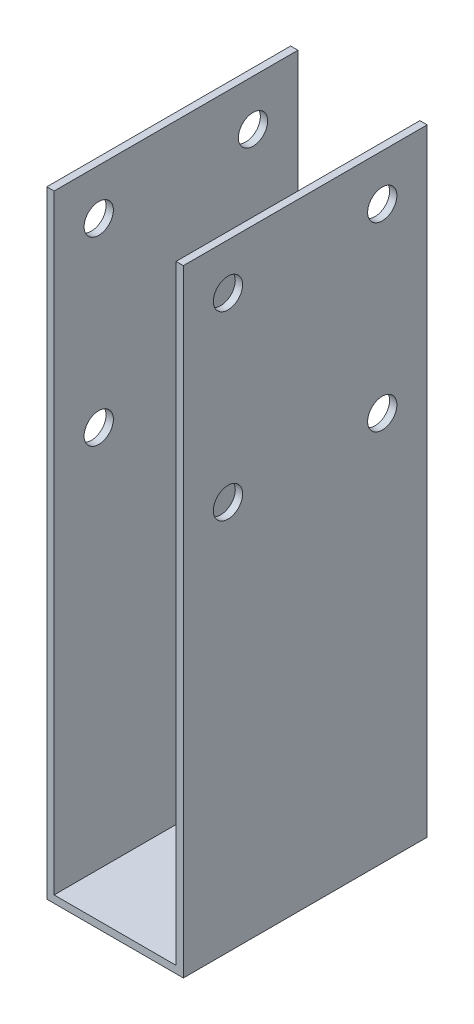
ISO-10303-21;
HEADER;
FILE_DESCRIPTION(('STEP AP214'),'2;1');
FILE_NAME('part.step','',(''),(''),'','','');
FILE_SCHEMA(('AUTOMOTIVE_DESIGN { 1 0 10303 214 1 1 1 1 }'));
ENDSEC;
DATA;
#1=APPLICATION_CONTEXT('core data for automotive mechanical design processes');
#2=APPLICATION_PROTOCOL_DEFINITION('international standard','automotive_design',2000,#1);
#3=PRODUCT_CONTEXT('',#1,'mechanical');
#4=PRODUCT('Part','Part','',(#3));
#5=PRODUCT_RELATED_PRODUCT_CATEGORY('part','',(#4));
#6=PRODUCT_DEFINITION_FORMATION('','',#4);
#7=PRODUCT_DEFINITION_CONTEXT('part definition',#1,'design');
#8=PRODUCT_DEFINITION('design','',#6,#7);
#9=PRODUCT_DEFINITION_SHAPE('','',#8);
#10=(LENGTH_UNIT() NAMED_UNIT(*) SI_UNIT(.MILLI.,.METRE.));
#11=(NAMED_UNIT(*) PLANE_ANGLE_UNIT() SI_UNIT($,.RADIAN.));
#12=(NAMED_UNIT(*) SI_UNIT($,.STERADIAN.) SOLID_ANGLE_UNIT());
#13=UNCERTAINTY_MEASURE_WITH_UNIT(LENGTH_MEASURE(1.E-05),#10,'distance_accuracy_value','');
#14=(GEOMETRIC_REPRESENTATION_CONTEXT(3) GLOBAL_UNCERTAINTY_ASSIGNED_CONTEXT((#13)) GLOBAL_UNIT_ASSIGNED_CONTEXT((#10,
#11,#12)) REPRESENTATION_CONTEXT('',''));
#15=CARTESIAN_POINT('',(0.,0.,0.));
#16=DIRECTION('',(0.,0.,1.));
#17=DIRECTION('',(1.,0.,0.));
#18=AXIS2_PLACEMENT_3D('',#15,#16,#17);
#19=CARTESIAN_POINT('',(25.,125.,100.));
#20=DIRECTION('',(1.,0.,0.));
#21=DIRECTION('',(0.,1.,0.));
#22=AXIS2_PLACEMENT_3D('',#19,#20,#21);
#23=PLANE('',#22);
#24=CARTESIAN_POINT('',(25.,106.115669713315,18.434102117834));
#25=DIRECTION('',(1.,0.,0.));
#26=DIRECTION('',(0.,1.,0.));
#27=AXIS2_PLACEMENT_3D('',#24,#25,#26);
#28=CIRCLE('',#27,6.00000000000001);
#29=CARTESIAN_POINT('',(25.,112.115669713315,18.434102117834));
#30=VERTEX_POINT('',#29);
#31=EDGE_CURVE('E186',#30,#30,#28,.T.);
#32=ORIENTED_EDGE('',*,*,#31,.T.);
#33=EDGE_LOOP('',(#32));
#34=FACE_BOUND('',#33,.T.);
#35=CARTESIAN_POINT('',(25.,31.8283759606693,18.434102117834));
#36=DIRECTION('',(1.,0.,0.));
#37=DIRECTION('',(0.,1.,0.));
#38=AXIS2_PLACEMENT_3D('',#35,#36,#37);
#39=CIRCLE('',#38,6.);
#40=CARTESIAN_POINT('',(25.,37.8283759606693,18.434102117834));
#41=VERTEX_POINT('',#40);
#42=EDGE_CURVE('E194',#41,#41,#39,.T.);
#43=ORIENTED_EDGE('',*,*,#42,.T.);
#44=EDGE_LOOP('',(#43));
#45=FACE_BOUND('',#44,.T.);
#46=CARTESIAN_POINT('',(25.,31.8283759606693,81.7042124749598));
#47=DIRECTION('',(1.,0.,0.));
#48=DIRECTION('',(0.,1.,0.));
#49=AXIS2_PLACEMENT_3D('',#46,#47,#48);
#50=CIRCLE('',#49,6.);
#51=CARTESIAN_POINT('',(25.,37.8283759606694,81.7042124749598));
#52=VERTEX_POINT('',#51);
#53=EDGE_CURVE('E200',#52,#52,#50,.T.);
#54=ORIENTED_EDGE('',*,*,#53,.T.);
#55=EDGE_LOOP('',(#54));
#56=FACE_BOUND('',#55,.T.);
#57=CARTESIAN_POINT('',(25.,106.115669713315,81.7042124749598));
#58=DIRECTION('',(1.,0.,0.));
#59=DIRECTION('',(0.,1.,0.));
#60=AXIS2_PLACEMENT_3D('',#57,#58,#59);
#61=CIRCLE('',#60,5.99999999999999);
#62=CARTESIAN_POINT('',(25.,112.115669713315,81.7042124749598));
#63=VERTEX_POINT('',#62);
#64=EDGE_CURVE('E133',#63,#63,#61,.T.);
#65=ORIENTED_EDGE('',*,*,#64,.T.);
#66=EDGE_LOOP('',(#65));
#67=FACE_BOUND('',#66,.T.);
#68=DIRECTION('',(0.,-1.,0.));
#69=VECTOR('',#68,1.);
#70=CARTESIAN_POINT('',(25.,125.,0.));
#71=LINE('',#70,#69);
#72=CARTESIAN_POINT('',(25.,125.,0.));
#73=VERTEX_POINT('',#72);
#74=CARTESIAN_POINT('',(25.,-125.,0.));
#75=VERTEX_POINT('',#74);
#76=EDGE_CURVE('E129',#73,#75,#71,.T.);
#77=ORIENTED_EDGE('',*,*,#76,.T.);
#78=DIRECTION('',(0.,0.,-1.));
#79=VECTOR('',#78,1.);
#80=CARTESIAN_POINT('',(25.,-125.,100.));
#81=LINE('',#80,#79);
#82=CARTESIAN_POINT('',(25.,-125.,100.));
#83=VERTEX_POINT('',#82);
#84=EDGE_CURVE('E11',#83,#75,#81,.T.);
#85=ORIENTED_EDGE('',*,*,#84,.F.);
#86=DIRECTION('',(0.,-1.,0.));
#87=VECTOR('',#86,1.);
#88=CARTESIAN_POINT('',(25.,125.,100.));
#89=LINE('',#88,#87);
#90=CARTESIAN_POINT('',(25.,125.,100.));
#91=VERTEX_POINT('',#90);
#92=EDGE_CURVE('E144',#91,#83,#89,.T.);
#93=ORIENTED_EDGE('',*,*,#92,.F.);
#94=DIRECTION('',(0.,0.,-1.));
#95=VECTOR('',#94,1.);
#96=CARTESIAN_POINT('',(25.,125.,100.));
#97=LINE('',#96,#95);
#98=EDGE_CURVE('E125',#91,#73,#97,.T.);
#99=ORIENTED_EDGE('',*,*,#98,.T.);
#100=EDGE_LOOP('',(#77,#85,#93,#99));
#101=FACE_BOUND('',#100,.T.);
#102=ADVANCED_FACE('F33',(#34,#45,#56,#67,#101),#23,.F.);
#103=CARTESIAN_POINT('',(-25.,-125.,100.));
#104=DIRECTION('',(0.,-1.,0.));
#105=DIRECTION('',(1.,0.,0.));
#106=AXIS2_PLACEMENT_3D('',#103,#104,#105);
#107=PLANE('',#106);
#108=DIRECTION('',(-1.,0.,0.));
#109=VECTOR('',#108,1.);
#110=CARTESIAN_POINT('',(-25.,-125.,0.));
#111=LINE('',#110,#109);
#112=CARTESIAN_POINT('',(-25.,-125.,0.));
#113=VERTEX_POINT('',#112);
#114=EDGE_CURVE('E132',#75,#113,#111,.T.);
#115=ORIENTED_EDGE('',*,*,#114,.T.);
#116=DIRECTION('',(0.,0.,-1.));
#117=VECTOR('',#116,1.);
#118=CARTESIAN_POINT('',(-25.,-125.,100.));
#119=LINE('',#118,#117);
#120=CARTESIAN_POINT('',(-25.,-125.,100.));
#121=VERTEX_POINT('',#120);
#122=EDGE_CURVE('E41',#121,#113,#119,.T.);
#123=ORIENTED_EDGE('',*,*,#122,.F.);
#124=DIRECTION('',(-1.,0.,0.));
#125=VECTOR('',#124,1.);
#126=CARTESIAN_POINT('',(-25.,-125.,100.));
#127=LINE('',#126,#125);
#128=EDGE_CURVE('E92',#83,#121,#127,.T.);
#129=ORIENTED_EDGE('',*,*,#128,.F.);
#130=ORIENTED_EDGE('',*,*,#84,.T.);
#131=EDGE_LOOP('',(#115,#123,#129,#130));
#132=FACE_BOUND('',#131,.T.);
#133=ADVANCED_FACE('F237',(#132),#107,.F.);
#134=CARTESIAN_POINT('',(-25.,125.,100.));
#135=DIRECTION('',(-1.,0.,0.));
#136=DIRECTION('',(0.,-1.,0.));
#137=AXIS2_PLACEMENT_3D('',#134,#135,#136);
#138=PLANE('',#137);
#139=CARTESIAN_POINT('',(-25.,106.115669713315,18.434102117834));
#140=DIRECTION('',(-1.,0.,0.));
#141=DIRECTION('',(0.,-1.,0.));
#142=AXIS2_PLACEMENT_3D('',#139,#140,#141);
#143=CIRCLE('',#142,6.00000000000001);
#144=CARTESIAN_POINT('',(-25.,100.115669713315,18.434102117834));
#145=VERTEX_POINT('',#144);
#146=EDGE_CURVE('E191',#145,#145,#143,.T.);
#147=ORIENTED_EDGE('',*,*,#146,.T.);
#148=EDGE_LOOP('',(#147));
#149=FACE_BOUND('',#148,.T.);
#150=CARTESIAN_POINT('',(-25.,31.8283759606693,18.434102117834));
#151=DIRECTION('',(-1.,0.,0.));
#152=DIRECTION('',(0.,-1.,0.));
#153=AXIS2_PLACEMENT_3D('',#150,#151,#152);
#154=CIRCLE('',#153,6.);
#155=CARTESIAN_POINT('',(-25.,25.8283759606693,18.434102117834));
#156=VERTEX_POINT('',#155);
#157=EDGE_CURVE('E197',#156,#156,#154,.T.);
#158=ORIENTED_EDGE('',*,*,#157,.T.);
#159=EDGE_LOOP('',(#158));
#160=FACE_BOUND('',#159,.T.);
#161=CARTESIAN_POINT('',(-25.,31.8283759606693,81.7042124749598));
#162=DIRECTION('',(-1.,0.,0.));
#163=DIRECTION('',(0.,-1.,0.));
#164=AXIS2_PLACEMENT_3D('',#161,#162,#163);
#165=CIRCLE('',#164,6.);
#166=CARTESIAN_POINT('',(-25.,25.8283759606693,81.7042124749598));
#167=VERTEX_POINT('',#166);
#168=EDGE_CURVE('E203',#167,#167,#165,.T.);
#169=ORIENTED_EDGE('',*,*,#168,.T.);
#170=EDGE_LOOP('',(#169));
#171=FACE_BOUND('',#170,.T.);
#172=CARTESIAN_POINT('',(-25.,106.115669713315,81.7042124749598));
#173=DIRECTION('',(-1.,0.,0.));
#174=DIRECTION('',(0.,-1.,0.));
#175=AXIS2_PLACEMENT_3D('',#172,#173,#174);
#176=CIRCLE('',#175,5.99999999999999);
#177=CARTESIAN_POINT('',(-25.,100.115669713315,81.7042124749598));
#178=VERTEX_POINT('',#177);
#179=EDGE_CURVE('E179',#178,#178,#176,.T.);
#180=ORIENTED_EDGE('',*,*,#179,.T.);
#181=EDGE_LOOP('',(#180));
#182=FACE_BOUND('',#181,.T.);
#183=DIRECTION('',(0.,1.,0.));
#184=VECTOR('',#183,1.);
#185=CARTESIAN_POINT('',(-25.,125.,0.));
#186=LINE('',#185,#184);
#187=CARTESIAN_POINT('',(-25.,125.,0.));
#188=VERTEX_POINT('',#187);
#189=EDGE_CURVE('E135',#113,#188,#186,.T.);
#190=ORIENTED_EDGE('',*,*,#189,.T.);
#191=DIRECTION('',(0.,0.,-1.));
#192=VECTOR('',#191,1.);
#193=CARTESIAN_POINT('',(-25.,125.,100.));
#194=LINE('',#193,#192);
#195=CARTESIAN_POINT('',(-25.,125.,100.));
#196=VERTEX_POINT('',#195);
#197=EDGE_CURVE('E151',#196,#188,#194,.T.);
#198=ORIENTED_EDGE('',*,*,#197,.F.);
#199=DIRECTION('',(0.,1.,0.));
#200=VECTOR('',#199,1.);
#201=CARTESIAN_POINT('',(-25.,125.,100.));
#202=LINE('',#201,#200);
#203=EDGE_CURVE('E159',#121,#196,#202,.T.);
#204=ORIENTED_EDGE('',*,*,#203,.F.);
#205=ORIENTED_EDGE('',*,*,#122,.T.);
#206=EDGE_LOOP('',(#190,#198,#204,#205));
#207=FACE_BOUND('',#206,.T.);
#208=ADVANCED_FACE('F157',(#149,#160,#171,#182,#207),#138,.F.);
#209=CARTESIAN_POINT('',(-25.,125.,100.));
#210=DIRECTION('',(0.,-1.,0.));
#211=DIRECTION('',(0.,0.,-1.));
#212=AXIS2_PLACEMENT_3D('',#209,#210,#211);
#213=PLANE('',#212);
#214=DIRECTION('',(-1.,0.,0.));
#215=VECTOR('',#214,1.);
#216=CARTESIAN_POINT('',(-25.,125.,0.));
#217=LINE('',#216,#215);
#218=CARTESIAN_POINT('',(-28.,125.,0.));
#219=VERTEX_POINT('',#218);
#220=EDGE_CURVE('E137',#188,#219,#217,.T.);
#221=ORIENTED_EDGE('',*,*,#220,.T.);
#222=DIRECTION('',(0.,0.,-1.));
#223=VECTOR('',#222,1.);
#224=CARTESIAN_POINT('',(-28.,125.,100.));
#225=LINE('',#224,#223);
#226=CARTESIAN_POINT('',(-28.,125.,100.));
#227=VERTEX_POINT('',#226);
#228=EDGE_CURVE('E148',#227,#219,#225,.T.);
#229=ORIENTED_EDGE('',*,*,#228,.F.);
#230=DIRECTION('',(-1.,0.,0.));
#231=VECTOR('',#230,1.);
#232=CARTESIAN_POINT('',(-25.,125.,100.));
#233=LINE('',#232,#231);
#234=EDGE_CURVE('E171',#196,#227,#233,.T.);
#235=ORIENTED_EDGE('',*,*,#234,.F.);
#236=ORIENTED_EDGE('',*,*,#197,.T.);
#237=EDGE_LOOP('',(#221,#229,#235,#236));
#238=FACE_BOUND('',#237,.T.);
#239=ADVANCED_FACE('F167',(#238),#213,.F.);
#240=CARTESIAN_POINT('',(-28.,125.,100.));
#241=DIRECTION('',(1.,0.,0.));
#242=DIRECTION('',(0.,1.,0.));
#243=AXIS2_PLACEMENT_3D('',#240,#241,#242);
#244=PLANE('',#243);
#245=CARTESIAN_POINT('',(-28.,106.115669713315,18.434102117834));
#246=DIRECTION('',(1.,0.,0.));
#247=DIRECTION('',(0.,1.,0.));
#248=AXIS2_PLACEMENT_3D('',#245,#246,#247);
#249=CIRCLE('',#248,6.00000000000001);
#250=CARTESIAN_POINT('',(-28.,112.115669713315,18.434102117834));
#251=VERTEX_POINT('',#250);
#252=EDGE_CURVE('E206',#251,#251,#249,.T.);
#253=ORIENTED_EDGE('',*,*,#252,.T.);
#254=EDGE_LOOP('',(#253));
#255=FACE_BOUND('',#254,.T.);
#256=CARTESIAN_POINT('',(-28.,31.8283759606693,18.434102117834));
#257=DIRECTION('',(1.,0.,0.));
#258=DIRECTION('',(0.,1.,0.));
#259=AXIS2_PLACEMENT_3D('',#256,#257,#258);
#260=CIRCLE('',#259,6.);
#261=CARTESIAN_POINT('',(-28.,37.8283759606693,18.434102117834));
#262=VERTEX_POINT('',#261);
#263=EDGE_CURVE('E216',#262,#262,#260,.T.);
#264=ORIENTED_EDGE('',*,*,#263,.T.);
#265=EDGE_LOOP('',(#264));
#266=FACE_BOUND('',#265,.T.);
#267=CARTESIAN_POINT('',(-28.,31.8283759606693,81.7042124749598));
#268=DIRECTION('',(1.,0.,0.));
#269=DIRECTION('',(0.,1.,0.));
#270=AXIS2_PLACEMENT_3D('',#267,#268,#269);
#271=CIRCLE('',#270,6.);
#272=CARTESIAN_POINT('',(-28.,37.8283759606693,81.7042124749598));
#273=VERTEX_POINT('',#272);
#274=EDGE_CURVE('E210',#273,#273,#271,.T.);
#275=ORIENTED_EDGE('',*,*,#274,.T.);
#276=EDGE_LOOP('',(#275));
#277=FACE_BOUND('',#276,.T.);
#278=CARTESIAN_POINT('',(-28.,106.115669713315,81.7042124749598));
#279=DIRECTION('',(1.,0.,0.));
#280=DIRECTION('',(0.,1.,0.));
#281=AXIS2_PLACEMENT_3D('',#278,#279,#280);
#282=CIRCLE('',#281,5.99999999999999);
#283=CARTESIAN_POINT('',(-28.,112.115669713315,81.7042124749598));
#284=VERTEX_POINT('',#283);
#285=EDGE_CURVE('E182',#284,#284,#282,.T.);
#286=ORIENTED_EDGE('',*,*,#285,.T.);
#287=EDGE_LOOP('',(#286));
#288=FACE_BOUND('',#287,.T.);
#289=DIRECTION('',(0.,-1.,0.));
#290=VECTOR('',#289,1.);
#291=CARTESIAN_POINT('',(-28.,125.,0.));
#292=LINE('',#291,#290);
#293=CARTESIAN_POINT('',(-28.,-128.,0.));
#294=VERTEX_POINT('',#293);
#295=EDGE_CURVE('E139',#219,#294,#292,.T.);
#296=ORIENTED_EDGE('',*,*,#295,.T.);
#297=DIRECTION('',(0.,0.,-1.));
#298=VECTOR('',#297,1.);
#299=CARTESIAN_POINT('',(-28.,-128.,100.));
#300=LINE('',#299,#298);
#301=CARTESIAN_POINT('',(-28.,-128.,100.));
#302=VERTEX_POINT('',#301);
#303=EDGE_CURVE('E120',#302,#294,#300,.T.);
#304=ORIENTED_EDGE('',*,*,#303,.F.);
#305=DIRECTION('',(0.,-1.,0.));
#306=VECTOR('',#305,1.);
#307=CARTESIAN_POINT('',(-28.,125.,100.));
#308=LINE('',#307,#306);
#309=EDGE_CURVE('E111',#227,#302,#308,.T.);
#310=ORIENTED_EDGE('',*,*,#309,.F.);
#311=ORIENTED_EDGE('',*,*,#228,.T.);
#312=EDGE_LOOP('',(#296,#304,#310,#311));
#313=FACE_BOUND('',#312,.T.);
#314=ADVANCED_FACE('F170',(#255,#266,#277,#288,#313),#244,.F.);
#315=CARTESIAN_POINT('',(-28.,-128.,100.));
#316=DIRECTION('',(0.,1.,0.));
#317=DIRECTION('',(-1.,0.,0.));
#318=AXIS2_PLACEMENT_3D('',#315,#316,#317);
#319=PLANE('',#318);
#320=DIRECTION('',(1.,0.,0.));
#321=VECTOR('',#320,1.);
#322=CARTESIAN_POINT('',(-28.,-128.,0.));
#323=LINE('',#322,#321);
#324=CARTESIAN_POINT('',(28.,-128.,0.));
#325=VERTEX_POINT('',#324);
#326=EDGE_CURVE('E119',#294,#325,#323,.T.);
#327=ORIENTED_EDGE('',*,*,#326,.T.);
#328=DIRECTION('',(0.,0.,-1.));
#329=VECTOR('',#328,1.);
#330=CARTESIAN_POINT('',(28.,-128.,100.));
#331=LINE('',#330,#329);
#332=CARTESIAN_POINT('',(28.,-128.,100.));
#333=VERTEX_POINT('',#332);
#334=EDGE_CURVE('E116',#333,#325,#331,.T.);
#335=ORIENTED_EDGE('',*,*,#334,.F.);
#336=DIRECTION('',(1.,0.,0.));
#337=VECTOR('',#336,1.);
#338=CARTESIAN_POINT('',(-28.,-128.,100.));
#339=LINE('',#338,#337);
#340=EDGE_CURVE('E105',#302,#333,#339,.T.);
#341=ORIENTED_EDGE('',*,*,#340,.F.);
#342=ORIENTED_EDGE('',*,*,#303,.T.);
#343=EDGE_LOOP('',(#327,#335,#341,#342));
#344=FACE_BOUND('',#343,.T.);
#345=ADVANCED_FACE('F117',(#344),#319,.F.);
#346=CARTESIAN_POINT('',(28.,125.,100.));
#347=DIRECTION('',(-1.,0.,0.));
#348=DIRECTION('',(0.,-1.,0.));
#349=AXIS2_PLACEMENT_3D('',#346,#347,#348);
#350=PLANE('',#349);
#351=CARTESIAN_POINT('',(28.,106.115669713315,18.434102117834));
#352=DIRECTION('',(1.,0.,0.));
#353=DIRECTION('',(0.,1.,0.));
#354=AXIS2_PLACEMENT_3D('',#351,#352,#353);
#355=CIRCLE('',#354,6.00000000000001);
#356=CARTESIAN_POINT('',(28.,112.115669713315,18.434102117834));
#357=VERTEX_POINT('',#356);
#358=EDGE_CURVE('E219',#357,#357,#355,.T.);
#359=ORIENTED_EDGE('',*,*,#358,.F.);
#360=EDGE_LOOP('',(#359));
#361=FACE_BOUND('',#360,.T.);
#362=CARTESIAN_POINT('',(28.,31.8283759606693,18.434102117834));
#363=DIRECTION('',(1.,0.,0.));
#364=DIRECTION('',(0.,1.,0.));
#365=AXIS2_PLACEMENT_3D('',#362,#363,#364);
#366=CIRCLE('',#365,6.);
#367=CARTESIAN_POINT('',(28.,37.8283759606693,18.434102117834));
#368=VERTEX_POINT('',#367);
#369=EDGE_CURVE('E213',#368,#368,#366,.T.);
#370=ORIENTED_EDGE('',*,*,#369,.F.);
#371=EDGE_LOOP('',(#370));
#372=FACE_BOUND('',#371,.T.);
#373=CARTESIAN_POINT('',(28.,31.8283759606693,81.7042124749598));
#374=DIRECTION('',(1.,0.,0.));
#375=DIRECTION('',(0.,1.,0.));
#376=AXIS2_PLACEMENT_3D('',#373,#374,#375);
#377=CIRCLE('',#376,6.);
#378=CARTESIAN_POINT('',(28.,37.8283759606694,81.7042124749598));
#379=VERTEX_POINT('',#378);
#380=EDGE_CURVE('E207',#379,#379,#377,.T.);
#381=ORIENTED_EDGE('',*,*,#380,.F.);
#382=EDGE_LOOP('',(#381));
#383=FACE_BOUND('',#382,.T.);
#384=CARTESIAN_POINT('',(28.,106.115669713315,81.7042124749598));
#385=DIRECTION('',(1.,0.,0.));
#386=DIRECTION('',(0.,1.,0.));
#387=AXIS2_PLACEMENT_3D('',#384,#385,#386);
#388=CIRCLE('',#387,5.99999999999999);
#389=CARTESIAN_POINT('',(28.,112.115669713315,81.7042124749598));
#390=VERTEX_POINT('',#389);
#391=EDGE_CURVE('E183',#390,#390,#388,.T.);
#392=ORIENTED_EDGE('',*,*,#391,.F.);
#393=EDGE_LOOP('',(#392));
#394=FACE_BOUND('',#393,.T.);
#395=DIRECTION('',(0.,1.,0.));
#396=VECTOR('',#395,1.);
#397=CARTESIAN_POINT('',(28.,125.,0.));
#398=LINE('',#397,#396);
#399=CARTESIAN_POINT('',(28.,125.,0.));
#400=VERTEX_POINT('',#399);
#401=EDGE_CURVE('E78',#325,#400,#398,.T.);
#402=ORIENTED_EDGE('',*,*,#401,.T.);
#403=DIRECTION('',(0.,0.,-1.));
#404=VECTOR('',#403,1.);
#405=CARTESIAN_POINT('',(28.,125.,100.));
#406=LINE('',#405,#404);
#407=CARTESIAN_POINT('',(28.,125.,100.));
#408=VERTEX_POINT('',#407);
#409=EDGE_CURVE('E121',#408,#400,#406,.T.);
#410=ORIENTED_EDGE('',*,*,#409,.F.);
#411=DIRECTION('',(0.,1.,0.));
#412=VECTOR('',#411,1.);
#413=CARTESIAN_POINT('',(28.,125.,100.));
#414=LINE('',#413,#412);
#415=EDGE_CURVE('E109',#333,#408,#414,.T.);
#416=ORIENTED_EDGE('',*,*,#415,.F.);
#417=ORIENTED_EDGE('',*,*,#334,.T.);
#418=EDGE_LOOP('',(#402,#410,#416,#417));
#419=FACE_BOUND('',#418,.T.);
#420=ADVANCED_FACE('F123',(#361,#372,#383,#394,#419),#350,.F.);
#421=CARTESIAN_POINT('',(25.,125.,100.));
#422=DIRECTION('',(0.,-1.,0.));
#423=DIRECTION('',(0.,0.,-1.));
#424=AXIS2_PLACEMENT_3D('',#421,#422,#423);
#425=PLANE('',#424);
#426=DIRECTION('',(-1.,0.,0.));
#427=VECTOR('',#426,1.);
#428=CARTESIAN_POINT('',(25.,125.,0.));
#429=LINE('',#428,#427);
#430=EDGE_CURVE('E84',#400,#73,#429,.T.);
#431=ORIENTED_EDGE('',*,*,#430,.T.);
#432=ORIENTED_EDGE('',*,*,#98,.F.);
#433=DIRECTION('',(-1.,0.,0.));
#434=VECTOR('',#433,1.);
#435=CARTESIAN_POINT('',(25.,125.,100.));
#436=LINE('',#435,#434);
#437=EDGE_CURVE('E49',#408,#91,#436,.T.);
#438=ORIENTED_EDGE('',*,*,#437,.F.);
#439=ORIENTED_EDGE('',*,*,#409,.T.);
#440=EDGE_LOOP('',(#431,#432,#438,#439));
#441=FACE_BOUND('',#440,.T.);
#442=ADVANCED_FACE('F278',(#441),#425,.F.);
#443=CARTESIAN_POINT('',(0.,0.,100.));
#444=DIRECTION('',(0.,0.,1.));
#445=DIRECTION('',(1.,0.,0.));
#446=AXIS2_PLACEMENT_3D('',#443,#444,#445);
#447=PLANE('',#446);
#448=ORIENTED_EDGE('',*,*,#92,.T.);
#449=ORIENTED_EDGE('',*,*,#128,.T.);
#450=ORIENTED_EDGE('',*,*,#203,.T.);
#451=ORIENTED_EDGE('',*,*,#234,.T.);
#452=ORIENTED_EDGE('',*,*,#309,.T.);
#453=ORIENTED_EDGE('',*,*,#340,.T.);
#454=ORIENTED_EDGE('',*,*,#415,.T.);
#455=ORIENTED_EDGE('',*,*,#437,.T.);
#456=EDGE_LOOP('',(#448,#449,#450,#451,#452,#453,#454,#455));
#457=FACE_BOUND('',#456,.T.);
#458=ADVANCED_FACE('F107',(#457),#447,.T.);
#459=CARTESIAN_POINT('',(0.,0.,0.));
#460=DIRECTION('',(0.,0.,1.));
#461=DIRECTION('',(1.,0.,0.));
#462=AXIS2_PLACEMENT_3D('',#459,#460,#461);
#463=PLANE('',#462);
#464=ORIENTED_EDGE('',*,*,#76,.F.);
#465=ORIENTED_EDGE('',*,*,#430,.F.);
#466=ORIENTED_EDGE('',*,*,#401,.F.);
#467=ORIENTED_EDGE('',*,*,#326,.F.);
#468=ORIENTED_EDGE('',*,*,#295,.F.);
#469=ORIENTED_EDGE('',*,*,#220,.F.);
#470=ORIENTED_EDGE('',*,*,#189,.F.);
#471=ORIENTED_EDGE('',*,*,#114,.F.);
#472=EDGE_LOOP('',(#464,#465,#466,#467,#468,#469,#470,#471));
#473=FACE_BOUND('',#472,.T.);
#474=ADVANCED_FACE('F163',(#473),#463,.F.);
#475=CARTESIAN_POINT('',(-28.,106.115669713315,81.7042124749598));
#476=DIRECTION('',(1.,0.,0.));
#477=DIRECTION('',(0.,1.,0.));
#478=AXIS2_PLACEMENT_3D('',#475,#476,#477);
#479=CYLINDRICAL_SURFACE('',#478,5.99999999999999);
#480=ORIENTED_EDGE('',*,*,#391,.T.);
#481=EDGE_LOOP('',(#480));
#482=FACE_BOUND('',#481,.T.);
#483=ORIENTED_EDGE('',*,*,#64,.F.);
#484=EDGE_LOOP('',(#483));
#485=FACE_BOUND('',#484,.T.);
#486=ADVANCED_FACE('F248',(#482,#485),#479,.F.);
#487=ORIENTED_EDGE('',*,*,#285,.F.);
#488=EDGE_LOOP('',(#487));
#489=FACE_BOUND('',#488,.T.);
#490=ORIENTED_EDGE('',*,*,#179,.F.);
#491=EDGE_LOOP('',(#490));
#492=FACE_BOUND('',#491,.T.);
#493=ADVANCED_FACE('F245',(#489,#492),#479,.F.);
#494=CARTESIAN_POINT('',(-28.,31.8283759606693,81.7042124749598));
#495=DIRECTION('',(1.,0.,0.));
#496=DIRECTION('',(0.,1.,0.));
#497=AXIS2_PLACEMENT_3D('',#494,#495,#496);
#498=CYLINDRICAL_SURFACE('',#497,6.);
#499=ORIENTED_EDGE('',*,*,#380,.T.);
#500=EDGE_LOOP('',(#499));
#501=FACE_BOUND('',#500,.T.);
#502=ORIENTED_EDGE('',*,*,#53,.F.);
#503=EDGE_LOOP('',(#502));
#504=FACE_BOUND('',#503,.T.);
#505=ADVANCED_FACE('F247',(#501,#504),#498,.F.);
#506=CARTESIAN_POINT('',(-28.,31.8283759606693,18.434102117834));
#507=DIRECTION('',(1.,0.,0.));
#508=DIRECTION('',(0.,1.,0.));
#509=AXIS2_PLACEMENT_3D('',#506,#507,#508);
#510=CYLINDRICAL_SURFACE('',#509,6.);
#511=ORIENTED_EDGE('',*,*,#369,.T.);
#512=EDGE_LOOP('',(#511));
#513=FACE_BOUND('',#512,.T.);
#514=ORIENTED_EDGE('',*,*,#42,.F.);
#515=EDGE_LOOP('',(#514));
#516=FACE_BOUND('',#515,.T.);
#517=ADVANCED_FACE('F255',(#513,#516),#510,.F.);
#518=CARTESIAN_POINT('',(-28.,106.115669713315,18.434102117834));
#519=DIRECTION('',(1.,0.,0.));
#520=DIRECTION('',(0.,1.,0.));
#521=AXIS2_PLACEMENT_3D('',#518,#519,#520);
#522=CYLINDRICAL_SURFACE('',#521,6.00000000000001);
#523=ORIENTED_EDGE('',*,*,#358,.T.);
#524=EDGE_LOOP('',(#523));
#525=FACE_BOUND('',#524,.T.);
#526=ORIENTED_EDGE('',*,*,#31,.F.);
#527=EDGE_LOOP('',(#526));
#528=FACE_BOUND('',#527,.T.);
#529=ADVANCED_FACE('F232',(#525,#528),#522,.F.);
#530=ORIENTED_EDGE('',*,*,#274,.F.);
#531=EDGE_LOOP('',(#530));
#532=FACE_BOUND('',#531,.T.);
#533=ORIENTED_EDGE('',*,*,#168,.F.);
#534=EDGE_LOOP('',(#533));
#535=FACE_BOUND('',#534,.T.);
#536=ADVANCED_FACE('F258',(#532,#535),#498,.F.);
#537=ORIENTED_EDGE('',*,*,#263,.F.);
#538=EDGE_LOOP('',(#537));
#539=FACE_BOUND('',#538,.T.);
#540=ORIENTED_EDGE('',*,*,#157,.F.);
#541=EDGE_LOOP('',(#540));
#542=FACE_BOUND('',#541,.T.);
#543=ADVANCED_FACE('F230',(#539,#542),#510,.F.);
#544=ORIENTED_EDGE('',*,*,#252,.F.);
#545=EDGE_LOOP('',(#544));
#546=FACE_BOUND('',#545,.T.);
#547=ORIENTED_EDGE('',*,*,#146,.F.);
#548=EDGE_LOOP('',(#547));
#549=FACE_BOUND('',#548,.T.);
#550=ADVANCED_FACE('F227',(#546,#549),#522,.F.);
#551=CLOSED_SHELL('',(#102,#133,#208,#239,#314,#345,#420,#442,#458,#474,#486,#493,#505,#517,
#529,#536,#543,#550));
#552=MANIFOLD_SOLID_BREP('B2',#551);
#553=ADVANCED_BREP_SHAPE_REPRESENTATION('',(#18,#552),#14);
#554=SHAPE_DEFINITION_REPRESENTATION(#9,#553);
ENDSEC;
END-ISO-10303-21;
